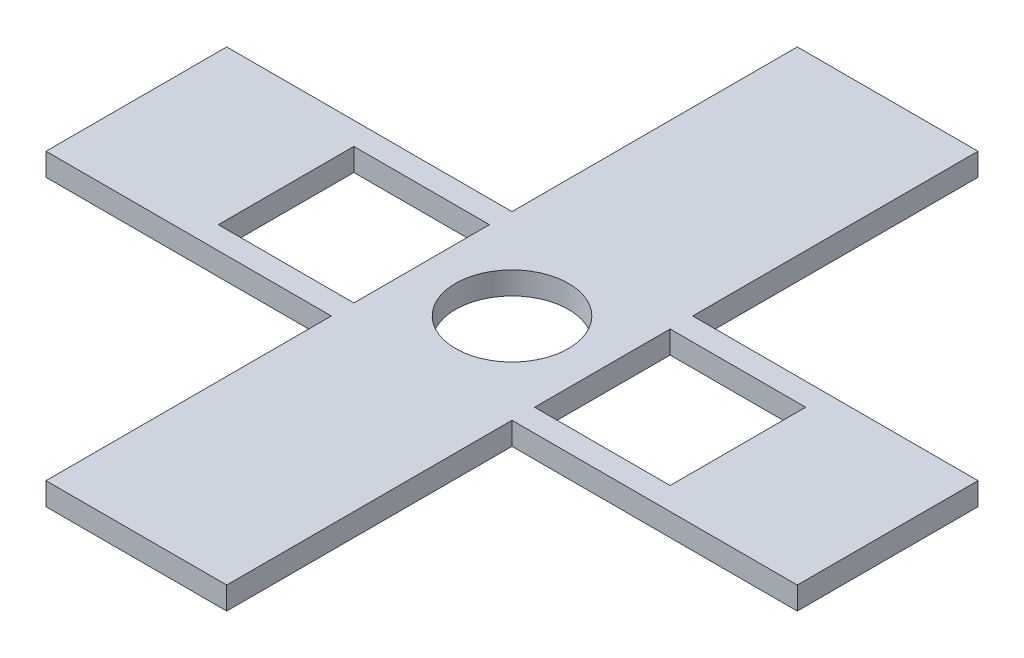
ISO-10303-21;
HEADER;
FILE_DESCRIPTION(('STEP AP214'),'2;1');
FILE_NAME('part.step','',(''),(''),'','','');
FILE_SCHEMA(('AUTOMOTIVE_DESIGN { 1 0 10303 214 1 1 1 1 }'));
ENDSEC;
DATA;
#1=APPLICATION_CONTEXT('core data for automotive mechanical design processes');
#2=APPLICATION_PROTOCOL_DEFINITION('international standard','automotive_design',2000,#1);
#3=PRODUCT_CONTEXT('',#1,'mechanical');
#4=PRODUCT('Part','Part','',(#3));
#5=PRODUCT_RELATED_PRODUCT_CATEGORY('part','',(#4));
#6=PRODUCT_DEFINITION_FORMATION('','',#4);
#7=PRODUCT_DEFINITION_CONTEXT('part definition',#1,'design');
#8=PRODUCT_DEFINITION('design','',#6,#7);
#9=PRODUCT_DEFINITION_SHAPE('','',#8);
#10=(LENGTH_UNIT() NAMED_UNIT(*) SI_UNIT(.MILLI.,.METRE.));
#11=(NAMED_UNIT(*) PLANE_ANGLE_UNIT() SI_UNIT($,.RADIAN.));
#12=(NAMED_UNIT(*) SI_UNIT($,.STERADIAN.) SOLID_ANGLE_UNIT());
#13=UNCERTAINTY_MEASURE_WITH_UNIT(LENGTH_MEASURE(1.E-05),#10,'distance_accuracy_value','');
#14=(GEOMETRIC_REPRESENTATION_CONTEXT(3) GLOBAL_UNCERTAINTY_ASSIGNED_CONTEXT((#13)) GLOBAL_UNIT_ASSIGNED_CONTEXT((#10,
#11,#12)) REPRESENTATION_CONTEXT('',''));
#15=CARTESIAN_POINT('',(0.,0.,0.));
#16=DIRECTION('',(0.,0.,1.));
#17=DIRECTION('',(1.,0.,0.));
#18=AXIS2_PLACEMENT_3D('',#15,#16,#17);
#19=CARTESIAN_POINT('',(0.,1.27,0.));
#20=DIRECTION('',(0.,1.,0.));
#21=DIRECTION('',(0.,0.,1.));
#22=AXIS2_PLACEMENT_3D('',#19,#20,#21);
#23=PLANE('',#22);
#24=DIRECTION('',(-1.,0.,0.));
#25=VECTOR('',#24,1.);
#26=CARTESIAN_POINT('',(-12.7,1.27,-3.81));
#27=LINE('',#26,#25);
#28=CARTESIAN_POINT('',(-5.08,1.27,-3.81));
#29=VERTEX_POINT('',#28);
#30=CARTESIAN_POINT('',(-12.7,1.27,-3.81));
#31=VERTEX_POINT('',#30);
#32=EDGE_CURVE('E178',#29,#31,#27,.T.);
#33=ORIENTED_EDGE('',*,*,#32,.F.);
#34=DIRECTION('',(0.,0.,-1.));
#35=VECTOR('',#34,1.);
#36=CARTESIAN_POINT('',(-5.08,1.27,-3.81));
#37=LINE('',#36,#35);
#38=CARTESIAN_POINT('',(-5.08,1.27,3.81));
#39=VERTEX_POINT('',#38);
#40=EDGE_CURVE('E170',#39,#29,#37,.T.);
#41=ORIENTED_EDGE('',*,*,#40,.F.);
#42=DIRECTION('',(1.,0.,0.));
#43=VECTOR('',#42,1.);
#44=CARTESIAN_POINT('',(-12.7,1.27,3.81));
#45=LINE('',#44,#43);
#46=CARTESIAN_POINT('',(-12.7,1.27,3.81));
#47=VERTEX_POINT('',#46);
#48=EDGE_CURVE('E193',#47,#39,#45,.T.);
#49=ORIENTED_EDGE('',*,*,#48,.F.);
#50=DIRECTION('',(0.,0.,1.));
#51=VECTOR('',#50,1.);
#52=CARTESIAN_POINT('',(-12.7,1.27,-3.81));
#53=LINE('',#52,#51);
#54=EDGE_CURVE('E191',#31,#47,#53,.T.);
#55=ORIENTED_EDGE('',*,*,#54,.F.);
#56=EDGE_LOOP('',(#33,#41,#49,#55));
#57=FACE_BOUND('',#56,.T.);
#58=DIRECTION('',(0.,0.,-1.));
#59=VECTOR('',#58,1.);
#60=CARTESIAN_POINT('',(5.07999999999999,1.27,5.08));
#61=LINE('',#60,#59);
#62=CARTESIAN_POINT('',(5.08,1.27,21.1201));
#63=VERTEX_POINT('',#62);
#64=CARTESIAN_POINT('',(5.07999999999999,1.27,5.08));
#65=VERTEX_POINT('',#64);
#66=EDGE_CURVE('E240',#63,#65,#61,.T.);
#67=ORIENTED_EDGE('',*,*,#66,.T.);
#68=DIRECTION('',(1.,0.,0.));
#69=VECTOR('',#68,1.);
#70=CARTESIAN_POINT('',(21.1201,1.27,5.08));
#71=LINE('',#70,#69);
#72=CARTESIAN_POINT('',(21.1201,1.27,5.08));
#73=VERTEX_POINT('',#72);
#74=EDGE_CURVE('E243',#65,#73,#71,.T.);
#75=ORIENTED_EDGE('',*,*,#74,.T.);
#76=DIRECTION('',(0.,0.,-1.));
#77=VECTOR('',#76,1.);
#78=CARTESIAN_POINT('',(21.1201,1.27,-5.08));
#79=LINE('',#78,#77);
#80=CARTESIAN_POINT('',(21.1201,1.27,-5.08));
#81=VERTEX_POINT('',#80);
#82=EDGE_CURVE('E246',#73,#81,#79,.T.);
#83=ORIENTED_EDGE('',*,*,#82,.T.);
#84=DIRECTION('',(-1.,0.,0.));
#85=VECTOR('',#84,1.);
#86=CARTESIAN_POINT('',(5.07999999999999,1.27,-5.08));
#87=LINE('',#86,#85);
#88=CARTESIAN_POINT('',(5.07999999999999,1.27,-5.08));
#89=VERTEX_POINT('',#88);
#90=EDGE_CURVE('E248',#81,#89,#87,.T.);
#91=ORIENTED_EDGE('',*,*,#90,.T.);
#92=DIRECTION('',(0.,0.,-1.));
#93=VECTOR('',#92,1.);
#94=CARTESIAN_POINT('',(5.07999999999999,1.27,-21.1201));
#95=LINE('',#94,#93);
#96=CARTESIAN_POINT('',(5.07999999999999,1.27,-21.1201));
#97=VERTEX_POINT('',#96);
#98=EDGE_CURVE('E250',#89,#97,#95,.T.);
#99=ORIENTED_EDGE('',*,*,#98,.T.);
#100=DIRECTION('',(-1.,0.,0.));
#101=VECTOR('',#100,1.);
#102=CARTESIAN_POINT('',(-5.08000000000001,1.27,-21.1201));
#103=LINE('',#102,#101);
#104=CARTESIAN_POINT('',(-5.08000000000001,1.27,-21.1201));
#105=VERTEX_POINT('',#104);
#106=EDGE_CURVE('E252',#97,#105,#103,.T.);
#107=ORIENTED_EDGE('',*,*,#106,.T.);
#108=DIRECTION('',(0.,0.,1.));
#109=VECTOR('',#108,1.);
#110=CARTESIAN_POINT('',(-5.08000000000001,1.27,-21.1201));
#111=LINE('',#110,#109);
#112=CARTESIAN_POINT('',(-5.08000000000001,1.27,-5.08));
#113=VERTEX_POINT('',#112);
#114=EDGE_CURVE('E254',#105,#113,#111,.T.);
#115=ORIENTED_EDGE('',*,*,#114,.T.);
#116=DIRECTION('',(-1.,0.,0.));
#117=VECTOR('',#116,1.);
#118=CARTESIAN_POINT('',(-21.1201,1.27,-5.08));
#119=LINE('',#118,#117);
#120=CARTESIAN_POINT('',(-21.1201,1.27,-5.08));
#121=VERTEX_POINT('',#120);
#122=EDGE_CURVE('E256',#113,#121,#119,.T.);
#123=ORIENTED_EDGE('',*,*,#122,.T.);
#124=DIRECTION('',(0.,0.,1.));
#125=VECTOR('',#124,1.);
#126=CARTESIAN_POINT('',(-21.1201,1.27,-5.08));
#127=LINE('',#126,#125);
#128=CARTESIAN_POINT('',(-21.1201,1.27,5.08));
#129=VERTEX_POINT('',#128);
#130=EDGE_CURVE('E258',#121,#129,#127,.T.);
#131=ORIENTED_EDGE('',*,*,#130,.T.);
#132=DIRECTION('',(1.,0.,0.));
#133=VECTOR('',#132,1.);
#134=CARTESIAN_POINT('',(-21.1201,1.27,5.08));
#135=LINE('',#134,#133);
#136=CARTESIAN_POINT('',(-5.08000000000001,1.27,5.08));
#137=VERTEX_POINT('',#136);
#138=EDGE_CURVE('E260',#129,#137,#135,.T.);
#139=ORIENTED_EDGE('',*,*,#138,.T.);
#140=DIRECTION('',(0.,0.,1.));
#141=VECTOR('',#140,1.);
#142=CARTESIAN_POINT('',(-5.08000000000001,1.27,5.08));
#143=LINE('',#142,#141);
#144=CARTESIAN_POINT('',(-5.08,1.27,21.1201));
#145=VERTEX_POINT('',#144);
#146=EDGE_CURVE('E262',#137,#145,#143,.T.);
#147=ORIENTED_EDGE('',*,*,#146,.T.);
#148=DIRECTION('',(1.,0.,0.));
#149=VECTOR('',#148,1.);
#150=CARTESIAN_POINT('',(-5.08,1.27,21.1201));
#151=LINE('',#150,#149);
#152=EDGE_CURVE('E264',#145,#63,#151,.T.);
#153=ORIENTED_EDGE('',*,*,#152,.T.);
#154=EDGE_LOOP('',(#67,#75,#83,#91,#99,#107,#115,#123,#131,#139,#147,#153));
#155=FACE_BOUND('',#154,.T.);
#156=DIRECTION('',(-1.,0.,0.));
#157=VECTOR('',#156,1.);
#158=CARTESIAN_POINT('',(5.08,1.27,-3.81));
#159=LINE('',#158,#157);
#160=CARTESIAN_POINT('',(12.7,1.27,-3.81));
#161=VERTEX_POINT('',#160);
#162=CARTESIAN_POINT('',(5.08,1.27,-3.81));
#163=VERTEX_POINT('',#162);
#164=EDGE_CURVE('E211',#161,#163,#159,.T.);
#165=ORIENTED_EDGE('',*,*,#164,.F.);
#166=DIRECTION('',(0.,0.,-1.));
#167=VECTOR('',#166,1.);
#168=CARTESIAN_POINT('',(12.7,1.27,-3.81));
#169=LINE('',#168,#167);
#170=CARTESIAN_POINT('',(12.7,1.27,3.81));
#171=VERTEX_POINT('',#170);
#172=EDGE_CURVE('E209',#171,#161,#169,.T.);
#173=ORIENTED_EDGE('',*,*,#172,.F.);
#174=DIRECTION('',(1.,0.,0.));
#175=VECTOR('',#174,1.);
#176=CARTESIAN_POINT('',(5.08,1.27,3.81));
#177=LINE('',#176,#175);
#178=CARTESIAN_POINT('',(5.08,1.27,3.81));
#179=VERTEX_POINT('',#178);
#180=EDGE_CURVE('E217',#179,#171,#177,.T.);
#181=ORIENTED_EDGE('',*,*,#180,.F.);
#182=DIRECTION('',(0.,0.,1.));
#183=VECTOR('',#182,1.);
#184=CARTESIAN_POINT('',(5.08,1.27,-3.81));
#185=LINE('',#184,#183);
#186=EDGE_CURVE('E214',#163,#179,#185,.T.);
#187=ORIENTED_EDGE('',*,*,#186,.F.);
#188=EDGE_LOOP('',(#165,#173,#181,#187));
#189=FACE_BOUND('',#188,.T.);
#190=CARTESIAN_POINT('',(0.,1.27,0.));
#191=DIRECTION('',(0.,1.,0.));
#192=DIRECTION('',(0.,0.,1.));
#193=AXIS2_PLACEMENT_3D('',#190,#191,#192);
#194=CIRCLE('',#193,3.175);
#195=CARTESIAN_POINT('',(0.,1.27,3.175));
#196=VERTEX_POINT('',#195);
#197=EDGE_CURVE('E199',#196,#196,#194,.T.);
#198=ORIENTED_EDGE('',*,*,#197,.F.);
#199=EDGE_LOOP('',(#198));
#200=FACE_BOUND('',#199,.T.);
#201=ADVANCED_FACE('F33',(#57,#155,#189,#200),#23,.T.);
#202=CARTESIAN_POINT('',(0.,0.,0.));
#203=DIRECTION('',(0.,1.,0.));
#204=DIRECTION('',(0.,0.,1.));
#205=AXIS2_PLACEMENT_3D('',#202,#203,#204);
#206=PLANE('',#205);
#207=DIRECTION('',(0.,0.,-1.));
#208=VECTOR('',#207,1.);
#209=CARTESIAN_POINT('',(-5.08,0.,-3.81));
#210=LINE('',#209,#208);
#211=CARTESIAN_POINT('',(-5.08,0.,3.81));
#212=VERTEX_POINT('',#211);
#213=CARTESIAN_POINT('',(-5.08,0.,-3.81));
#214=VERTEX_POINT('',#213);
#215=EDGE_CURVE('E56',#212,#214,#210,.T.);
#216=ORIENTED_EDGE('',*,*,#215,.T.);
#217=DIRECTION('',(-1.,0.,0.));
#218=VECTOR('',#217,1.);
#219=CARTESIAN_POINT('',(-12.7,0.,-3.81));
#220=LINE('',#219,#218);
#221=CARTESIAN_POINT('',(-12.7,0.,-3.81));
#222=VERTEX_POINT('',#221);
#223=EDGE_CURVE('E185',#214,#222,#220,.T.);
#224=ORIENTED_EDGE('',*,*,#223,.T.);
#225=DIRECTION('',(0.,0.,1.));
#226=VECTOR('',#225,1.);
#227=CARTESIAN_POINT('',(-12.7,0.,-3.81));
#228=LINE('',#227,#226);
#229=CARTESIAN_POINT('',(-12.7,0.,3.81));
#230=VERTEX_POINT('',#229);
#231=EDGE_CURVE('E201',#222,#230,#228,.T.);
#232=ORIENTED_EDGE('',*,*,#231,.T.);
#233=DIRECTION('',(1.,0.,0.));
#234=VECTOR('',#233,1.);
#235=CARTESIAN_POINT('',(-12.7,0.,3.81));
#236=LINE('',#235,#234);
#237=EDGE_CURVE('E179',#230,#212,#236,.T.);
#238=ORIENTED_EDGE('',*,*,#237,.T.);
#239=EDGE_LOOP('',(#216,#224,#232,#238));
#240=FACE_BOUND('',#239,.T.);
#241=DIRECTION('',(0.,0.,-1.));
#242=VECTOR('',#241,1.);
#243=CARTESIAN_POINT('',(5.07999999999999,0.,5.08));
#244=LINE('',#243,#242);
#245=CARTESIAN_POINT('',(5.08,0.,21.1201));
#246=VERTEX_POINT('',#245);
#247=CARTESIAN_POINT('',(5.07999999999999,0.,5.08));
#248=VERTEX_POINT('',#247);
#249=EDGE_CURVE('E239',#246,#248,#244,.T.);
#250=ORIENTED_EDGE('',*,*,#249,.F.);
#251=DIRECTION('',(1.,0.,0.));
#252=VECTOR('',#251,1.);
#253=CARTESIAN_POINT('',(-5.08,0.,21.1201));
#254=LINE('',#253,#252);
#255=CARTESIAN_POINT('',(-5.08,0.,21.1201));
#256=VERTEX_POINT('',#255);
#257=EDGE_CURVE('E244',#256,#246,#254,.T.);
#258=ORIENTED_EDGE('',*,*,#257,.F.);
#259=DIRECTION('',(0.,0.,1.));
#260=VECTOR('',#259,1.);
#261=CARTESIAN_POINT('',(-5.08000000000001,0.,5.08));
#262=LINE('',#261,#260);
#263=CARTESIAN_POINT('',(-5.08000000000001,0.,5.08));
#264=VERTEX_POINT('',#263);
#265=EDGE_CURVE('E287',#264,#256,#262,.T.);
#266=ORIENTED_EDGE('',*,*,#265,.F.);
#267=DIRECTION('',(1.,0.,0.));
#268=VECTOR('',#267,1.);
#269=CARTESIAN_POINT('',(-21.1201,0.,5.08));
#270=LINE('',#269,#268);
#271=CARTESIAN_POINT('',(-21.1201,0.,5.08));
#272=VERTEX_POINT('',#271);
#273=EDGE_CURVE('E285',#272,#264,#270,.T.);
#274=ORIENTED_EDGE('',*,*,#273,.F.);
#275=DIRECTION('',(0.,0.,1.));
#276=VECTOR('',#275,1.);
#277=CARTESIAN_POINT('',(-21.1201,0.,-5.08));
#278=LINE('',#277,#276);
#279=CARTESIAN_POINT('',(-21.1201,0.,-5.08));
#280=VERTEX_POINT('',#279);
#281=EDGE_CURVE('E283',#280,#272,#278,.T.);
#282=ORIENTED_EDGE('',*,*,#281,.F.);
#283=DIRECTION('',(-1.,0.,0.));
#284=VECTOR('',#283,1.);
#285=CARTESIAN_POINT('',(-21.1201,0.,-5.08));
#286=LINE('',#285,#284);
#287=CARTESIAN_POINT('',(-5.08000000000001,0.,-5.08));
#288=VERTEX_POINT('',#287);
#289=EDGE_CURVE('E281',#288,#280,#286,.T.);
#290=ORIENTED_EDGE('',*,*,#289,.F.);
#291=DIRECTION('',(0.,0.,1.));
#292=VECTOR('',#291,1.);
#293=CARTESIAN_POINT('',(-5.08000000000001,0.,-21.1201));
#294=LINE('',#293,#292);
#295=CARTESIAN_POINT('',(-5.08000000000001,0.,-21.1201));
#296=VERTEX_POINT('',#295);
#297=EDGE_CURVE('E279',#296,#288,#294,.T.);
#298=ORIENTED_EDGE('',*,*,#297,.F.);
#299=DIRECTION('',(-1.,0.,0.));
#300=VECTOR('',#299,1.);
#301=CARTESIAN_POINT('',(-5.08000000000001,0.,-21.1201));
#302=LINE('',#301,#300);
#303=CARTESIAN_POINT('',(5.07999999999999,0.,-21.1201));
#304=VERTEX_POINT('',#303);
#305=EDGE_CURVE('E277',#304,#296,#302,.T.);
#306=ORIENTED_EDGE('',*,*,#305,.F.);
#307=DIRECTION('',(0.,0.,-1.));
#308=VECTOR('',#307,1.);
#309=CARTESIAN_POINT('',(5.07999999999999,0.,-21.1201));
#310=LINE('',#309,#308);
#311=CARTESIAN_POINT('',(5.07999999999999,0.,-5.08));
#312=VERTEX_POINT('',#311);
#313=EDGE_CURVE('E275',#312,#304,#310,.T.);
#314=ORIENTED_EDGE('',*,*,#313,.F.);
#315=DIRECTION('',(-1.,0.,0.));
#316=VECTOR('',#315,1.);
#317=CARTESIAN_POINT('',(5.07999999999999,0.,-5.08));
#318=LINE('',#317,#316);
#319=CARTESIAN_POINT('',(21.1201,0.,-5.08));
#320=VERTEX_POINT('',#319);
#321=EDGE_CURVE('E273',#320,#312,#318,.T.);
#322=ORIENTED_EDGE('',*,*,#321,.F.);
#323=DIRECTION('',(0.,0.,-1.));
#324=VECTOR('',#323,1.);
#325=CARTESIAN_POINT('',(21.1201,0.,-5.08));
#326=LINE('',#325,#324);
#327=CARTESIAN_POINT('',(21.1201,0.,5.08));
#328=VERTEX_POINT('',#327);
#329=EDGE_CURVE('E271',#328,#320,#326,.T.);
#330=ORIENTED_EDGE('',*,*,#329,.F.);
#331=DIRECTION('',(1.,0.,0.));
#332=VECTOR('',#331,1.);
#333=CARTESIAN_POINT('',(21.1201,0.,5.08));
#334=LINE('',#333,#332);
#335=EDGE_CURVE('E269',#248,#328,#334,.T.);
#336=ORIENTED_EDGE('',*,*,#335,.F.);
#337=EDGE_LOOP('',(#250,#258,#266,#274,#282,#290,#298,#306,#314,#322,#330,#336));
#338=FACE_BOUND('',#337,.T.);
#339=DIRECTION('',(0.,0.,-1.));
#340=VECTOR('',#339,1.);
#341=CARTESIAN_POINT('',(12.7,0.,-3.81));
#342=LINE('',#341,#340);
#343=CARTESIAN_POINT('',(12.7,0.,3.81));
#344=VERTEX_POINT('',#343);
#345=CARTESIAN_POINT('',(12.7,0.,-3.81));
#346=VERTEX_POINT('',#345);
#347=EDGE_CURVE('E186',#344,#346,#342,.T.);
#348=ORIENTED_EDGE('',*,*,#347,.T.);
#349=DIRECTION('',(-1.,0.,0.));
#350=VECTOR('',#349,1.);
#351=CARTESIAN_POINT('',(5.08,0.,-3.81));
#352=LINE('',#351,#350);
#353=CARTESIAN_POINT('',(5.08,0.,-3.81));
#354=VERTEX_POINT('',#353);
#355=EDGE_CURVE('E222',#346,#354,#352,.T.);
#356=ORIENTED_EDGE('',*,*,#355,.T.);
#357=DIRECTION('',(0.,0.,1.));
#358=VECTOR('',#357,1.);
#359=CARTESIAN_POINT('',(5.08,0.,-3.81));
#360=LINE('',#359,#358);
#361=CARTESIAN_POINT('',(5.08,0.,3.81));
#362=VERTEX_POINT('',#361);
#363=EDGE_CURVE('E225',#354,#362,#360,.T.);
#364=ORIENTED_EDGE('',*,*,#363,.T.);
#365=DIRECTION('',(1.,0.,0.));
#366=VECTOR('',#365,1.);
#367=CARTESIAN_POINT('',(5.08,0.,3.81));
#368=LINE('',#367,#366);
#369=EDGE_CURVE('E212',#362,#344,#368,.T.);
#370=ORIENTED_EDGE('',*,*,#369,.T.);
#371=EDGE_LOOP('',(#348,#356,#364,#370));
#372=FACE_BOUND('',#371,.T.);
#373=CARTESIAN_POINT('',(0.,0.,0.));
#374=DIRECTION('',(0.,1.,0.));
#375=DIRECTION('',(0.,0.,1.));
#376=AXIS2_PLACEMENT_3D('',#373,#374,#375);
#377=CIRCLE('',#376,3.175);
#378=CARTESIAN_POINT('',(0.,0.,3.175));
#379=VERTEX_POINT('',#378);
#380=EDGE_CURVE('E581',#379,#379,#377,.T.);
#381=ORIENTED_EDGE('',*,*,#380,.T.);
#382=EDGE_LOOP('',(#381));
#383=FACE_BOUND('',#382,.T.);
#384=ADVANCED_FACE('F329',(#240,#338,#372,#383),#206,.F.);
#385=CARTESIAN_POINT('',(5.07999999999999,1.27,5.08));
#386=DIRECTION('',(-1.,0.,0.));
#387=DIRECTION('',(0.,0.,1.));
#388=AXIS2_PLACEMENT_3D('',#385,#386,#387);
#389=PLANE('',#388);
#390=ORIENTED_EDGE('',*,*,#249,.T.);
#391=DIRECTION('',(0.,-1.,0.));
#392=VECTOR('',#391,1.);
#393=CARTESIAN_POINT('',(5.07999999999999,1.27,5.08));
#394=LINE('',#393,#392);
#395=EDGE_CURVE('E11',#65,#248,#394,.T.);
#396=ORIENTED_EDGE('',*,*,#395,.F.);
#397=ORIENTED_EDGE('',*,*,#66,.F.);
#398=DIRECTION('',(0.,-1.,0.));
#399=VECTOR('',#398,1.);
#400=CARTESIAN_POINT('',(5.08,1.27,21.1201));
#401=LINE('',#400,#399);
#402=EDGE_CURVE('E266',#63,#246,#401,.T.);
#403=ORIENTED_EDGE('',*,*,#402,.T.);
#404=EDGE_LOOP('',(#390,#396,#397,#403));
#405=FACE_BOUND('',#404,.T.);
#406=ADVANCED_FACE('F35',(#405),#389,.F.);
#407=CARTESIAN_POINT('',(21.1201,1.27,5.08));
#408=DIRECTION('',(0.,0.,-1.));
#409=DIRECTION('',(-1.,0.,0.));
#410=AXIS2_PLACEMENT_3D('',#407,#408,#409);
#411=PLANE('',#410);
#412=ORIENTED_EDGE('',*,*,#335,.T.);
#413=DIRECTION('',(0.,-1.,0.));
#414=VECTOR('',#413,1.);
#415=CARTESIAN_POINT('',(21.1201,1.27,5.08));
#416=LINE('',#415,#414);
#417=EDGE_CURVE('E41',#73,#328,#416,.T.);
#418=ORIENTED_EDGE('',*,*,#417,.F.);
#419=ORIENTED_EDGE('',*,*,#74,.F.);
#420=ORIENTED_EDGE('',*,*,#395,.T.);
#421=EDGE_LOOP('',(#412,#418,#419,#420));
#422=FACE_BOUND('',#421,.T.);
#423=ADVANCED_FACE('F346',(#422),#411,.F.);
#424=CARTESIAN_POINT('',(21.1201,1.27,-5.08));
#425=DIRECTION('',(-1.,0.,0.));
#426=DIRECTION('',(0.,0.,1.));
#427=AXIS2_PLACEMENT_3D('',#424,#425,#426);
#428=PLANE('',#427);
#429=ORIENTED_EDGE('',*,*,#329,.T.);
#430=DIRECTION('',(0.,-1.,0.));
#431=VECTOR('',#430,1.);
#432=CARTESIAN_POINT('',(21.1201,1.27,-5.08));
#433=LINE('',#432,#431);
#434=EDGE_CURVE('E316',#81,#320,#433,.T.);
#435=ORIENTED_EDGE('',*,*,#434,.F.);
#436=ORIENTED_EDGE('',*,*,#82,.F.);
#437=ORIENTED_EDGE('',*,*,#417,.T.);
#438=EDGE_LOOP('',(#429,#435,#436,#437));
#439=FACE_BOUND('',#438,.T.);
#440=ADVANCED_FACE('F323',(#439),#428,.F.);
#441=CARTESIAN_POINT('',(5.07999999999999,1.27,-5.08));
#442=DIRECTION('',(0.,0.,1.));
#443=DIRECTION('',(1.,0.,0.));
#444=AXIS2_PLACEMENT_3D('',#441,#442,#443);
#445=PLANE('',#444);
#446=ORIENTED_EDGE('',*,*,#321,.T.);
#447=DIRECTION('',(0.,-1.,0.));
#448=VECTOR('',#447,1.);
#449=CARTESIAN_POINT('',(5.07999999999999,1.27,-5.08));
#450=LINE('',#449,#448);
#451=EDGE_CURVE('E313',#89,#312,#450,.T.);
#452=ORIENTED_EDGE('',*,*,#451,.F.);
#453=ORIENTED_EDGE('',*,*,#90,.F.);
#454=ORIENTED_EDGE('',*,*,#434,.T.);
#455=EDGE_LOOP('',(#446,#452,#453,#454));
#456=FACE_BOUND('',#455,.T.);
#457=ADVANCED_FACE('F335',(#456),#445,.F.);
#458=CARTESIAN_POINT('',(5.07999999999999,1.27,-21.1201));
#459=DIRECTION('',(-1.,0.,0.));
#460=DIRECTION('',(0.,0.,1.));
#461=AXIS2_PLACEMENT_3D('',#458,#459,#460);
#462=PLANE('',#461);
#463=ORIENTED_EDGE('',*,*,#313,.T.);
#464=DIRECTION('',(0.,-1.,0.));
#465=VECTOR('',#464,1.);
#466=CARTESIAN_POINT('',(5.07999999999999,1.27,-21.1201));
#467=LINE('',#466,#465);
#468=EDGE_CURVE('E310',#97,#304,#467,.T.);
#469=ORIENTED_EDGE('',*,*,#468,.F.);
#470=ORIENTED_EDGE('',*,*,#98,.F.);
#471=ORIENTED_EDGE('',*,*,#451,.T.);
#472=EDGE_LOOP('',(#463,#469,#470,#471));
#473=FACE_BOUND('',#472,.T.);
#474=ADVANCED_FACE('F339',(#473),#462,.F.);
#475=CARTESIAN_POINT('',(-5.08000000000001,1.27,-21.1201));
#476=DIRECTION('',(0.,0.,1.));
#477=DIRECTION('',(1.,0.,0.));
#478=AXIS2_PLACEMENT_3D('',#475,#476,#477);
#479=PLANE('',#478);
#480=ORIENTED_EDGE('',*,*,#305,.T.);
#481=DIRECTION('',(0.,-1.,0.));
#482=VECTOR('',#481,1.);
#483=CARTESIAN_POINT('',(-5.08000000000001,1.27,-21.1201));
#484=LINE('',#483,#482);
#485=EDGE_CURVE('E307',#105,#296,#484,.T.);
#486=ORIENTED_EDGE('',*,*,#485,.F.);
#487=ORIENTED_EDGE('',*,*,#106,.F.);
#488=ORIENTED_EDGE('',*,*,#468,.T.);
#489=EDGE_LOOP('',(#480,#486,#487,#488));
#490=FACE_BOUND('',#489,.T.);
#491=ADVANCED_FACE('F379',(#490),#479,.F.);
#492=CARTESIAN_POINT('',(-5.08000000000001,1.27,-21.1201));
#493=DIRECTION('',(1.,0.,0.));
#494=DIRECTION('',(0.,0.,-1.));
#495=AXIS2_PLACEMENT_3D('',#492,#493,#494);
#496=PLANE('',#495);
#497=ORIENTED_EDGE('',*,*,#297,.T.);
#498=DIRECTION('',(0.,-1.,0.));
#499=VECTOR('',#498,1.);
#500=CARTESIAN_POINT('',(-5.08000000000001,1.27,-5.08));
#501=LINE('',#500,#499);
#502=EDGE_CURVE('E304',#113,#288,#501,.T.);
#503=ORIENTED_EDGE('',*,*,#502,.F.);
#504=ORIENTED_EDGE('',*,*,#114,.F.);
#505=ORIENTED_EDGE('',*,*,#485,.T.);
#506=EDGE_LOOP('',(#497,#503,#504,#505));
#507=FACE_BOUND('',#506,.T.);
#508=ADVANCED_FACE('F377',(#507),#496,.F.);
#509=CARTESIAN_POINT('',(-21.1201,1.27,-5.08));
#510=DIRECTION('',(0.,0.,1.));
#511=DIRECTION('',(1.,0.,0.));
#512=AXIS2_PLACEMENT_3D('',#509,#510,#511);
#513=PLANE('',#512);
#514=ORIENTED_EDGE('',*,*,#289,.T.);
#515=DIRECTION('',(0.,-1.,0.));
#516=VECTOR('',#515,1.);
#517=CARTESIAN_POINT('',(-21.1201,1.27,-5.08));
#518=LINE('',#517,#516);
#519=EDGE_CURVE('E301',#121,#280,#518,.T.);
#520=ORIENTED_EDGE('',*,*,#519,.F.);
#521=ORIENTED_EDGE('',*,*,#122,.F.);
#522=ORIENTED_EDGE('',*,*,#502,.T.);
#523=EDGE_LOOP('',(#514,#520,#521,#522));
#524=FACE_BOUND('',#523,.T.);
#525=ADVANCED_FACE('F373',(#524),#513,.F.);
#526=CARTESIAN_POINT('',(-21.1201,1.27,-5.08));
#527=DIRECTION('',(1.,0.,0.));
#528=DIRECTION('',(0.,0.,-1.));
#529=AXIS2_PLACEMENT_3D('',#526,#527,#528);
#530=PLANE('',#529);
#531=ORIENTED_EDGE('',*,*,#281,.T.);
#532=DIRECTION('',(0.,-1.,0.));
#533=VECTOR('',#532,1.);
#534=CARTESIAN_POINT('',(-21.1201,1.27,5.08));
#535=LINE('',#534,#533);
#536=EDGE_CURVE('E298',#129,#272,#535,.T.);
#537=ORIENTED_EDGE('',*,*,#536,.F.);
#538=ORIENTED_EDGE('',*,*,#130,.F.);
#539=ORIENTED_EDGE('',*,*,#519,.T.);
#540=EDGE_LOOP('',(#531,#537,#538,#539));
#541=FACE_BOUND('',#540,.T.);
#542=ADVANCED_FACE('F368',(#541),#530,.F.);
#543=CARTESIAN_POINT('',(-21.1201,1.27,5.08));
#544=DIRECTION('',(0.,0.,-1.));
#545=DIRECTION('',(-1.,0.,0.));
#546=AXIS2_PLACEMENT_3D('',#543,#544,#545);
#547=PLANE('',#546);
#548=ORIENTED_EDGE('',*,*,#273,.T.);
#549=DIRECTION('',(0.,-1.,0.));
#550=VECTOR('',#549,1.);
#551=CARTESIAN_POINT('',(-5.08000000000001,1.27,5.08));
#552=LINE('',#551,#550);
#553=EDGE_CURVE('E295',#137,#264,#552,.T.);
#554=ORIENTED_EDGE('',*,*,#553,.F.);
#555=ORIENTED_EDGE('',*,*,#138,.F.);
#556=ORIENTED_EDGE('',*,*,#536,.T.);
#557=EDGE_LOOP('',(#548,#554,#555,#556));
#558=FACE_BOUND('',#557,.T.);
#559=ADVANCED_FACE('F362',(#558),#547,.F.);
#560=CARTESIAN_POINT('',(-5.08000000000001,1.27,5.08));
#561=DIRECTION('',(1.,0.,0.));
#562=DIRECTION('',(0.,0.,-1.));
#563=AXIS2_PLACEMENT_3D('',#560,#561,#562);
#564=PLANE('',#563);
#565=ORIENTED_EDGE('',*,*,#265,.T.);
#566=DIRECTION('',(0.,-1.,0.));
#567=VECTOR('',#566,1.);
#568=CARTESIAN_POINT('',(-5.08,1.27,21.1201));
#569=LINE('',#568,#567);
#570=EDGE_CURVE('E292',#145,#256,#569,.T.);
#571=ORIENTED_EDGE('',*,*,#570,.F.);
#572=ORIENTED_EDGE('',*,*,#146,.F.);
#573=ORIENTED_EDGE('',*,*,#553,.T.);
#574=EDGE_LOOP('',(#565,#571,#572,#573));
#575=FACE_BOUND('',#574,.T.);
#576=ADVANCED_FACE('F358',(#575),#564,.F.);
#577=CARTESIAN_POINT('',(-5.08,1.27,21.1201));
#578=DIRECTION('',(0.,0.,-1.));
#579=DIRECTION('',(-1.,0.,0.));
#580=AXIS2_PLACEMENT_3D('',#577,#578,#579);
#581=PLANE('',#580);
#582=ORIENTED_EDGE('',*,*,#257,.T.);
#583=ORIENTED_EDGE('',*,*,#402,.F.);
#584=ORIENTED_EDGE('',*,*,#152,.F.);
#585=ORIENTED_EDGE('',*,*,#570,.T.);
#586=EDGE_LOOP('',(#582,#583,#584,#585));
#587=FACE_BOUND('',#586,.T.);
#588=ADVANCED_FACE('F353',(#587),#581,.F.);
#589=CARTESIAN_POINT('',(12.7,1.27,-3.81));
#590=DIRECTION('',(-1.,0.,0.));
#591=DIRECTION('',(0.,0.,1.));
#592=AXIS2_PLACEMENT_3D('',#589,#590,#591);
#593=PLANE('',#592);
#594=ORIENTED_EDGE('',*,*,#347,.F.);
#595=DIRECTION('',(0.,-1.,0.));
#596=VECTOR('',#595,1.);
#597=CARTESIAN_POINT('',(12.7,1.27,3.81));
#598=LINE('',#597,#596);
#599=EDGE_CURVE('E219',#171,#344,#598,.T.);
#600=ORIENTED_EDGE('',*,*,#599,.F.);
#601=ORIENTED_EDGE('',*,*,#172,.T.);
#602=DIRECTION('',(0.,-1.,0.));
#603=VECTOR('',#602,1.);
#604=CARTESIAN_POINT('',(12.7,1.27,-3.81));
#605=LINE('',#604,#603);
#606=EDGE_CURVE('E236',#161,#346,#605,.T.);
#607=ORIENTED_EDGE('',*,*,#606,.T.);
#608=EDGE_LOOP('',(#594,#600,#601,#607));
#609=FACE_BOUND('',#608,.T.);
#610=ADVANCED_FACE('F396',(#609),#593,.T.);
#611=CARTESIAN_POINT('',(5.08,1.27,-3.81));
#612=DIRECTION('',(0.,0.,1.));
#613=DIRECTION('',(1.,0.,0.));
#614=AXIS2_PLACEMENT_3D('',#611,#612,#613);
#615=PLANE('',#614);
#616=ORIENTED_EDGE('',*,*,#355,.F.);
#617=ORIENTED_EDGE('',*,*,#606,.F.);
#618=ORIENTED_EDGE('',*,*,#164,.T.);
#619=DIRECTION('',(0.,-1.,0.));
#620=VECTOR('',#619,1.);
#621=CARTESIAN_POINT('',(5.08,1.27,-3.81));
#622=LINE('',#621,#620);
#623=EDGE_CURVE('E234',#163,#354,#622,.T.);
#624=ORIENTED_EDGE('',*,*,#623,.T.);
#625=EDGE_LOOP('',(#616,#617,#618,#624));
#626=FACE_BOUND('',#625,.T.);
#627=ADVANCED_FACE('F434',(#626),#615,.T.);
#628=CARTESIAN_POINT('',(5.08,1.27,-3.81));
#629=DIRECTION('',(1.,0.,0.));
#630=DIRECTION('',(0.,0.,-1.));
#631=AXIS2_PLACEMENT_3D('',#628,#629,#630);
#632=PLANE('',#631);
#633=ORIENTED_EDGE('',*,*,#363,.F.);
#634=ORIENTED_EDGE('',*,*,#623,.F.);
#635=ORIENTED_EDGE('',*,*,#186,.T.);
#636=DIRECTION('',(0.,-1.,0.));
#637=VECTOR('',#636,1.);
#638=CARTESIAN_POINT('',(5.08,1.27,3.81));
#639=LINE('',#638,#637);
#640=EDGE_CURVE('E232',#179,#362,#639,.T.);
#641=ORIENTED_EDGE('',*,*,#640,.T.);
#642=EDGE_LOOP('',(#633,#634,#635,#641));
#643=FACE_BOUND('',#642,.T.);
#644=ADVANCED_FACE('F441',(#643),#632,.T.);
#645=CARTESIAN_POINT('',(5.08,1.27,3.81));
#646=DIRECTION('',(0.,0.,-1.));
#647=DIRECTION('',(-1.,0.,0.));
#648=AXIS2_PLACEMENT_3D('',#645,#646,#647);
#649=PLANE('',#648);
#650=ORIENTED_EDGE('',*,*,#369,.F.);
#651=ORIENTED_EDGE('',*,*,#640,.F.);
#652=ORIENTED_EDGE('',*,*,#180,.T.);
#653=ORIENTED_EDGE('',*,*,#599,.T.);
#654=EDGE_LOOP('',(#650,#651,#652,#653));
#655=FACE_BOUND('',#654,.T.);
#656=ADVANCED_FACE('F448',(#655),#649,.T.);
#657=CARTESIAN_POINT('',(-5.08,1.27,-3.81));
#658=DIRECTION('',(-1.,0.,0.));
#659=DIRECTION('',(0.,0.,1.));
#660=AXIS2_PLACEMENT_3D('',#657,#658,#659);
#661=PLANE('',#660);
#662=ORIENTED_EDGE('',*,*,#215,.F.);
#663=DIRECTION('',(0.,-1.,0.));
#664=VECTOR('',#663,1.);
#665=CARTESIAN_POINT('',(-5.08,1.27,3.81));
#666=LINE('',#665,#664);
#667=EDGE_CURVE('E174',#39,#212,#666,.T.);
#668=ORIENTED_EDGE('',*,*,#667,.F.);
#669=ORIENTED_EDGE('',*,*,#40,.T.);
#670=DIRECTION('',(0.,-1.,0.));
#671=VECTOR('',#670,1.);
#672=CARTESIAN_POINT('',(-5.08,1.27,-3.81));
#673=LINE('',#672,#671);
#674=EDGE_CURVE('E173',#29,#214,#673,.T.);
#675=ORIENTED_EDGE('',*,*,#674,.T.);
#676=EDGE_LOOP('',(#662,#668,#669,#675));
#677=FACE_BOUND('',#676,.T.);
#678=ADVANCED_FACE('F172',(#677),#661,.T.);
#679=CARTESIAN_POINT('',(-12.7,1.27,-3.81));
#680=DIRECTION('',(0.,0.,1.));
#681=DIRECTION('',(1.,0.,0.));
#682=AXIS2_PLACEMENT_3D('',#679,#680,#681);
#683=PLANE('',#682);
#684=ORIENTED_EDGE('',*,*,#223,.F.);
#685=ORIENTED_EDGE('',*,*,#674,.F.);
#686=ORIENTED_EDGE('',*,*,#32,.T.);
#687=DIRECTION('',(0.,-1.,0.));
#688=VECTOR('',#687,1.);
#689=CARTESIAN_POINT('',(-12.7,1.27,-3.81));
#690=LINE('',#689,#688);
#691=EDGE_CURVE('E187',#31,#222,#690,.T.);
#692=ORIENTED_EDGE('',*,*,#691,.T.);
#693=EDGE_LOOP('',(#684,#685,#686,#692));
#694=FACE_BOUND('',#693,.T.);
#695=ADVANCED_FACE('F182',(#694),#683,.T.);
#696=CARTESIAN_POINT('',(-12.7,1.27,-3.81));
#697=DIRECTION('',(1.,0.,0.));
#698=DIRECTION('',(0.,0.,-1.));
#699=AXIS2_PLACEMENT_3D('',#696,#697,#698);
#700=PLANE('',#699);
#701=ORIENTED_EDGE('',*,*,#231,.F.);
#702=ORIENTED_EDGE('',*,*,#691,.F.);
#703=ORIENTED_EDGE('',*,*,#54,.T.);
#704=DIRECTION('',(0.,-1.,0.));
#705=VECTOR('',#704,1.);
#706=CARTESIAN_POINT('',(-12.7,1.27,3.81));
#707=LINE('',#706,#705);
#708=EDGE_CURVE('E48',#47,#230,#707,.T.);
#709=ORIENTED_EDGE('',*,*,#708,.T.);
#710=EDGE_LOOP('',(#701,#702,#703,#709));
#711=FACE_BOUND('',#710,.T.);
#712=ADVANCED_FACE('F469',(#711),#700,.T.);
#713=CARTESIAN_POINT('',(-12.7,1.27,3.81));
#714=DIRECTION('',(0.,0.,-1.));
#715=DIRECTION('',(-1.,0.,0.));
#716=AXIS2_PLACEMENT_3D('',#713,#714,#715);
#717=PLANE('',#716);
#718=ORIENTED_EDGE('',*,*,#237,.F.);
#719=ORIENTED_EDGE('',*,*,#708,.F.);
#720=ORIENTED_EDGE('',*,*,#48,.T.);
#721=ORIENTED_EDGE('',*,*,#667,.T.);
#722=EDGE_LOOP('',(#718,#719,#720,#721));
#723=FACE_BOUND('',#722,.T.);
#724=ADVANCED_FACE('F476',(#723),#717,.T.);
#725=CARTESIAN_POINT('',(0.,1.27,0.));
#726=DIRECTION('',(0.,-1.,0.));
#727=DIRECTION('',(0.,0.,-1.));
#728=AXIS2_PLACEMENT_3D('',#725,#726,#727);
#729=CYLINDRICAL_SURFACE('',#728,3.175);
#730=ORIENTED_EDGE('',*,*,#197,.T.);
#731=EDGE_LOOP('',(#730));
#732=FACE_BOUND('',#731,.T.);
#733=ORIENTED_EDGE('',*,*,#380,.F.);
#734=EDGE_LOOP('',(#733));
#735=FACE_BOUND('',#734,.T.);
#736=ADVANCED_FACE('F484',(#732,#735),#729,.F.);
#737=CLOSED_SHELL('',(#201,#384,#406,#423,#440,#457,#474,#491,#508,#525,#542,#559,#576,#588,
#610,#627,#644,#656,#678,#695,#712,#724,#736));
#738=MANIFOLD_SOLID_BREP('B2',#737);
#739=ADVANCED_BREP_SHAPE_REPRESENTATION('',(#18,#738),#14);
#740=SHAPE_DEFINITION_REPRESENTATION(#9,#739);
ENDSEC;
END-ISO-10303-21;
